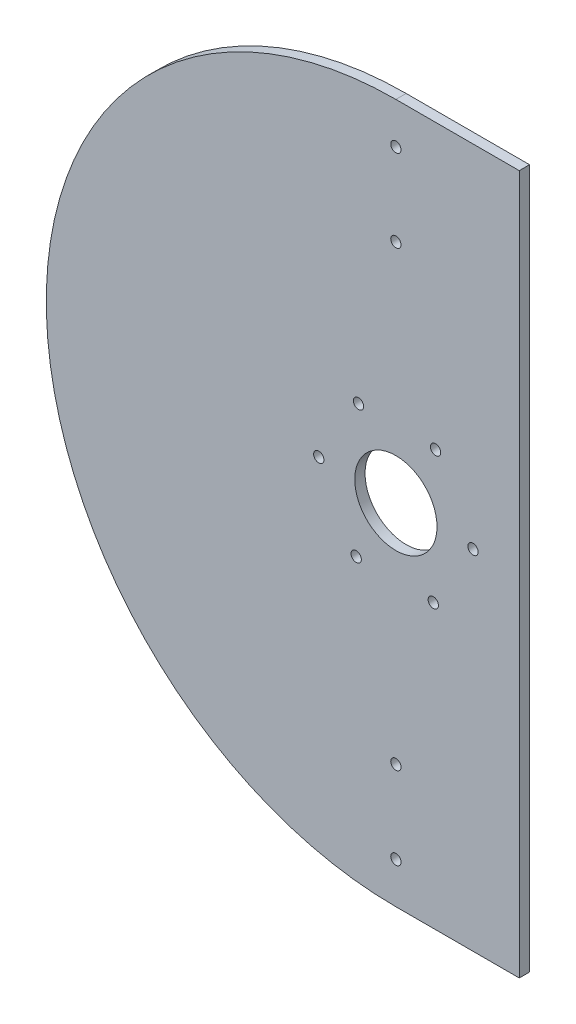
ISO-10303-21;
HEADER;
FILE_DESCRIPTION(('STEP AP214'),'2;1');
FILE_NAME('part.step','',(''),(''),'','','');
FILE_SCHEMA(('AUTOMOTIVE_DESIGN { 1 0 10303 214 1 1 1 1 }'));
ENDSEC;
DATA;
#1=APPLICATION_CONTEXT('core data for automotive mechanical design processes');
#2=APPLICATION_PROTOCOL_DEFINITION('international standard','automotive_design',2000,#1);
#3=PRODUCT_CONTEXT('',#1,'mechanical');
#4=PRODUCT('Part','Part','',(#3));
#5=PRODUCT_RELATED_PRODUCT_CATEGORY('part','',(#4));
#6=PRODUCT_DEFINITION_FORMATION('','',#4);
#7=PRODUCT_DEFINITION_CONTEXT('part definition',#1,'design');
#8=PRODUCT_DEFINITION('design','',#6,#7);
#9=PRODUCT_DEFINITION_SHAPE('','',#8);
#10=(LENGTH_UNIT() NAMED_UNIT(*) SI_UNIT(.MILLI.,.METRE.));
#11=(NAMED_UNIT(*) PLANE_ANGLE_UNIT() SI_UNIT($,.RADIAN.));
#12=(NAMED_UNIT(*) SI_UNIT($,.STERADIAN.) SOLID_ANGLE_UNIT());
#13=UNCERTAINTY_MEASURE_WITH_UNIT(LENGTH_MEASURE(1.E-05),#10,'distance_accuracy_value','');
#14=(GEOMETRIC_REPRESENTATION_CONTEXT(3) GLOBAL_UNCERTAINTY_ASSIGNED_CONTEXT((#13)) GLOBAL_UNIT_ASSIGNED_CONTEXT((#10,
#11,#12)) REPRESENTATION_CONTEXT('',''));
#15=CARTESIAN_POINT('',(0.,0.,0.));
#16=DIRECTION('',(0.,0.,1.));
#17=DIRECTION('',(1.,0.,0.));
#18=AXIS2_PLACEMENT_3D('',#15,#16,#17);
#19=CARTESIAN_POINT('',(0.,0.,0.));
#20=DIRECTION('',(0.,0.,1.));
#21=DIRECTION('',(1.,0.,0.));
#22=AXIS2_PLACEMENT_3D('',#19,#20,#21);
#23=PLANE('',#22);
#24=CARTESIAN_POINT('',(0.,0.,0.));
#25=DIRECTION('',(0.,0.,-1.));
#26=DIRECTION('',(-1.,0.,0.));
#27=AXIS2_PLACEMENT_3D('',#24,#25,#26);
#28=CIRCLE('',#27,12.7);
#29=CARTESIAN_POINT('',(-12.7,0.,0.));
#30=VERTEX_POINT('',#29);
#31=EDGE_CURVE('E211',#30,#30,#28,.T.);
#32=ORIENTED_EDGE('',*,*,#31,.F.);
#33=EDGE_LOOP('',(#32));
#34=FACE_BOUND('',#33,.T.);
#35=CARTESIAN_POINT('',(0.,95.25,0.));
#36=DIRECTION('',(0.,0.,-1.));
#37=DIRECTION('',(-1.,0.,0.));
#38=AXIS2_PLACEMENT_3D('',#35,#36,#37);
#39=CIRCLE('',#38,1.58749999999999);
#40=CARTESIAN_POINT('',(-1.58749999999999,95.25,0.));
#41=VERTEX_POINT('',#40);
#42=EDGE_CURVE('E207',#41,#41,#39,.T.);
#43=ORIENTED_EDGE('',*,*,#42,.F.);
#44=EDGE_LOOP('',(#43));
#45=FACE_BOUND('',#44,.T.);
#46=CARTESIAN_POINT('',(0.,-95.25,0.));
#47=DIRECTION('',(0.,0.,-1.));
#48=DIRECTION('',(-1.,0.,0.));
#49=AXIS2_PLACEMENT_3D('',#46,#47,#48);
#50=CIRCLE('',#49,1.58749999999999);
#51=CARTESIAN_POINT('',(-1.58750000000001,-95.25,0.));
#52=VERTEX_POINT('',#51);
#53=EDGE_CURVE('E199',#52,#52,#50,.T.);
#54=ORIENTED_EDGE('',*,*,#53,.F.);
#55=EDGE_LOOP('',(#54));
#56=FACE_BOUND('',#55,.T.);
#57=CARTESIAN_POINT('',(0.,-69.85,0.));
#58=DIRECTION('',(0.,0.,-1.));
#59=DIRECTION('',(-1.,0.,0.));
#60=AXIS2_PLACEMENT_3D('',#57,#58,#59);
#61=CIRCLE('',#60,1.58749999999999);
#62=CARTESIAN_POINT('',(-1.58750000000001,-69.85,0.));
#63=VERTEX_POINT('',#62);
#64=EDGE_CURVE('E191',#63,#63,#61,.T.);
#65=ORIENTED_EDGE('',*,*,#64,.F.);
#66=EDGE_LOOP('',(#65));
#67=FACE_BOUND('',#66,.T.);
#68=CARTESIAN_POINT('',(0.,69.85,0.));
#69=DIRECTION('',(0.,0.,-1.));
#70=DIRECTION('',(-1.,0.,0.));
#71=AXIS2_PLACEMENT_3D('',#68,#69,#70);
#72=CIRCLE('',#71,1.58749999999999);
#73=CARTESIAN_POINT('',(-1.58749999999999,69.85,0.));
#74=VERTEX_POINT('',#73);
#75=EDGE_CURVE('E183',#74,#74,#72,.T.);
#76=ORIENTED_EDGE('',*,*,#75,.F.);
#77=EDGE_LOOP('',(#76));
#78=FACE_BOUND('',#77,.T.);
#79=CARTESIAN_POINT('',(-11.5463634943787,20.8258648393213,0.));
#80=DIRECTION('',(0.,0.,-1.));
#81=DIRECTION('',(-1.,0.,0.));
#82=AXIS2_PLACEMENT_3D('',#79,#80,#81);
#83=CIRCLE('',#82,1.58749999999999);
#84=CARTESIAN_POINT('',(-13.1338634943786,20.8258648393213,0.));
#85=VERTEX_POINT('',#84);
#86=EDGE_CURVE('E167',#85,#85,#83,.T.);
#87=ORIENTED_EDGE('',*,*,#86,.F.);
#88=EDGE_LOOP('',(#87));
#89=FACE_BOUND('',#88,.T.);
#90=CARTESIAN_POINT('',(12.2625462594441,20.4123765271219,0.));
#91=DIRECTION('',(0.,0.,-1.));
#92=DIRECTION('',(-1.,0.,0.));
#93=AXIS2_PLACEMENT_3D('',#90,#91,#92);
#94=CIRCLE('',#93,1.58749999999999);
#95=CARTESIAN_POINT('',(10.6750462594441,20.4123765271219,0.));
#96=VERTEX_POINT('',#95);
#97=EDGE_CURVE('E159',#96,#96,#94,.T.);
#98=ORIENTED_EDGE('',*,*,#97,.F.);
#99=EDGE_LOOP('',(#98));
#100=FACE_BOUND('',#99,.T.);
#101=CARTESIAN_POINT('',(23.8089097538227,-0.413488312199489,0.));
#102=DIRECTION('',(0.,0.,-1.));
#103=DIRECTION('',(-1.,0.,0.));
#104=AXIS2_PLACEMENT_3D('',#101,#102,#103);
#105=CIRCLE('',#104,1.58749999999999);
#106=CARTESIAN_POINT('',(22.2214097538227,-0.413488312199489,0.));
#107=VERTEX_POINT('',#106);
#108=EDGE_CURVE('E151',#107,#107,#105,.T.);
#109=ORIENTED_EDGE('',*,*,#108,.F.);
#110=EDGE_LOOP('',(#109));
#111=FACE_BOUND('',#110,.T.);
#112=CARTESIAN_POINT('',(11.5463634943787,-20.8258648393213,0.));
#113=DIRECTION('',(0.,0.,-1.));
#114=DIRECTION('',(-1.,0.,0.));
#115=AXIS2_PLACEMENT_3D('',#112,#113,#114);
#116=CIRCLE('',#115,1.58749999999999);
#117=CARTESIAN_POINT('',(9.95886349437867,-20.8258648393213,0.));
#118=VERTEX_POINT('',#117);
#119=EDGE_CURVE('E143',#118,#118,#116,.T.);
#120=ORIENTED_EDGE('',*,*,#119,.F.);
#121=EDGE_LOOP('',(#120));
#122=FACE_BOUND('',#121,.T.);
#123=CARTESIAN_POINT('',(0.,0.,0.));
#124=DIRECTION('',(0.,0.,1.));
#125=DIRECTION('',(1.,0.,0.));
#126=AXIS2_PLACEMENT_3D('',#123,#124,#125);
#127=CIRCLE('',#126,107.95);
#128=CARTESIAN_POINT('',(0.,107.95,0.));
#129=VERTEX_POINT('',#128);
#130=CARTESIAN_POINT('',(0.,-107.95,0.));
#131=VERTEX_POINT('',#130);
#132=EDGE_CURVE('E111',#129,#131,#127,.T.);
#133=ORIENTED_EDGE('',*,*,#132,.F.);
#134=DIRECTION('',(-1.,0.,0.));
#135=VECTOR('',#134,1.);
#136=CARTESIAN_POINT('',(0.,107.95,0.));
#137=LINE('',#136,#135);
#138=CARTESIAN_POINT('',(38.1,107.95,0.));
#139=VERTEX_POINT('',#138);
#140=EDGE_CURVE('E81',#139,#129,#137,.T.);
#141=ORIENTED_EDGE('',*,*,#140,.F.);
#142=DIRECTION('',(0.,1.,0.));
#143=VECTOR('',#142,1.);
#144=CARTESIAN_POINT('',(38.1,107.95,0.));
#145=LINE('',#144,#143);
#146=CARTESIAN_POINT('',(38.1,-107.95,0.));
#147=VERTEX_POINT('',#146);
#148=EDGE_CURVE('E75',#147,#139,#145,.T.);
#149=ORIENTED_EDGE('',*,*,#148,.F.);
#150=DIRECTION('',(1.,0.,0.));
#151=VECTOR('',#150,1.);
#152=CARTESIAN_POINT('',(38.1,-107.95,0.));
#153=LINE('',#152,#151);
#154=EDGE_CURVE('E99',#131,#147,#153,.T.);
#155=ORIENTED_EDGE('',*,*,#154,.F.);
#156=EDGE_LOOP('',(#133,#141,#149,#155));
#157=FACE_BOUND('',#156,.T.);
#158=CARTESIAN_POINT('',(-12.2625462594441,-20.4123765271219,0.));
#159=DIRECTION('',(0.,0.,-1.));
#160=DIRECTION('',(-1.,0.,0.));
#161=AXIS2_PLACEMENT_3D('',#158,#159,#160);
#162=CIRCLE('',#161,1.58749999999999);
#163=CARTESIAN_POINT('',(-13.8500462594441,-20.4123765271219,0.));
#164=VERTEX_POINT('',#163);
#165=EDGE_CURVE('E135',#164,#164,#162,.T.);
#166=ORIENTED_EDGE('',*,*,#165,.F.);
#167=EDGE_LOOP('',(#166));
#168=FACE_BOUND('',#167,.T.);
#169=CARTESIAN_POINT('',(-23.8089097538228,0.413488312199489,0.));
#170=DIRECTION('',(0.,0.,-1.));
#171=DIRECTION('',(-1.,0.,0.));
#172=AXIS2_PLACEMENT_3D('',#169,#170,#171);
#173=CIRCLE('',#172,1.58749999999999);
#174=CARTESIAN_POINT('',(-25.3964097538227,0.413488312199489,0.));
#175=VERTEX_POINT('',#174);
#176=EDGE_CURVE('E175',#175,#175,#173,.T.);
#177=ORIENTED_EDGE('',*,*,#176,.F.);
#178=EDGE_LOOP('',(#177));
#179=FACE_BOUND('',#178,.T.);
#180=ADVANCED_FACE('F39',(#34,#45,#56,#67,#78,#89,#100,#111,#122,#157,#168,#179),#23,.F.);
#181=CARTESIAN_POINT('',(0.,0.,3.175));
#182=DIRECTION('',(0.,0.,1.));
#183=DIRECTION('',(1.,0.,0.));
#184=AXIS2_PLACEMENT_3D('',#181,#182,#183);
#185=PLANE('',#184);
#186=CARTESIAN_POINT('',(0.,0.,3.175));
#187=DIRECTION('',(0.,0.,1.));
#188=DIRECTION('',(1.,0.,0.));
#189=AXIS2_PLACEMENT_3D('',#186,#187,#188);
#190=CIRCLE('',#189,12.7);
#191=CARTESIAN_POINT('',(12.7,0.,3.175));
#192=VERTEX_POINT('',#191);
#193=EDGE_CURVE('E43',#192,#192,#190,.T.);
#194=ORIENTED_EDGE('',*,*,#193,.F.);
#195=EDGE_LOOP('',(#194));
#196=FACE_BOUND('',#195,.T.);
#197=CARTESIAN_POINT('',(0.,95.25,3.175));
#198=DIRECTION('',(0.,0.,-1.));
#199=DIRECTION('',(-1.,0.,0.));
#200=AXIS2_PLACEMENT_3D('',#197,#198,#199);
#201=CIRCLE('',#200,1.5875);
#202=CARTESIAN_POINT('',(-1.5875,95.25,3.175));
#203=VERTEX_POINT('',#202);
#204=EDGE_CURVE('E203',#203,#203,#201,.T.);
#205=ORIENTED_EDGE('',*,*,#204,.T.);
#206=EDGE_LOOP('',(#205));
#207=FACE_BOUND('',#206,.T.);
#208=CARTESIAN_POINT('',(0.,-95.25,3.175));
#209=DIRECTION('',(0.,0.,-1.));
#210=DIRECTION('',(-1.,0.,0.));
#211=AXIS2_PLACEMENT_3D('',#208,#209,#210);
#212=CIRCLE('',#211,1.5875);
#213=CARTESIAN_POINT('',(-1.58750000000002,-95.25,3.175));
#214=VERTEX_POINT('',#213);
#215=EDGE_CURVE('E195',#214,#214,#212,.T.);
#216=ORIENTED_EDGE('',*,*,#215,.T.);
#217=EDGE_LOOP('',(#216));
#218=FACE_BOUND('',#217,.T.);
#219=CARTESIAN_POINT('',(0.,-69.85,3.175));
#220=DIRECTION('',(0.,0.,-1.));
#221=DIRECTION('',(-1.,0.,0.));
#222=AXIS2_PLACEMENT_3D('',#219,#220,#221);
#223=CIRCLE('',#222,1.5875);
#224=CARTESIAN_POINT('',(-1.58750000000002,-69.85,3.175));
#225=VERTEX_POINT('',#224);
#226=EDGE_CURVE('E187',#225,#225,#223,.T.);
#227=ORIENTED_EDGE('',*,*,#226,.T.);
#228=EDGE_LOOP('',(#227));
#229=FACE_BOUND('',#228,.T.);
#230=CARTESIAN_POINT('',(0.,69.85,3.175));
#231=DIRECTION('',(0.,0.,-1.));
#232=DIRECTION('',(-1.,0.,0.));
#233=AXIS2_PLACEMENT_3D('',#230,#231,#232);
#234=CIRCLE('',#233,1.5875);
#235=CARTESIAN_POINT('',(-1.5875,69.85,3.175));
#236=VERTEX_POINT('',#235);
#237=EDGE_CURVE('E179',#236,#236,#234,.T.);
#238=ORIENTED_EDGE('',*,*,#237,.T.);
#239=EDGE_LOOP('',(#238));
#240=FACE_BOUND('',#239,.T.);
#241=CARTESIAN_POINT('',(-23.8089097538228,0.413488312199489,3.175));
#242=DIRECTION('',(0.,0.,-1.));
#243=DIRECTION('',(-1.,0.,0.));
#244=AXIS2_PLACEMENT_3D('',#241,#242,#243);
#245=CIRCLE('',#244,1.5875);
#246=CARTESIAN_POINT('',(-25.3964097538228,0.413488312199489,3.175));
#247=VERTEX_POINT('',#246);
#248=EDGE_CURVE('E171',#247,#247,#245,.T.);
#249=ORIENTED_EDGE('',*,*,#248,.T.);
#250=EDGE_LOOP('',(#249));
#251=FACE_BOUND('',#250,.T.);
#252=CARTESIAN_POINT('',(-11.5463634943787,20.8258648393213,3.175));
#253=DIRECTION('',(0.,0.,-1.));
#254=DIRECTION('',(-1.,0.,0.));
#255=AXIS2_PLACEMENT_3D('',#252,#253,#254);
#256=CIRCLE('',#255,1.5875);
#257=CARTESIAN_POINT('',(-13.1338634943787,20.8258648393213,3.175));
#258=VERTEX_POINT('',#257);
#259=EDGE_CURVE('E163',#258,#258,#256,.T.);
#260=ORIENTED_EDGE('',*,*,#259,.T.);
#261=EDGE_LOOP('',(#260));
#262=FACE_BOUND('',#261,.T.);
#263=CARTESIAN_POINT('',(12.2625462594441,20.4123765271219,3.175));
#264=DIRECTION('',(0.,0.,-1.));
#265=DIRECTION('',(-1.,0.,0.));
#266=AXIS2_PLACEMENT_3D('',#263,#264,#265);
#267=CIRCLE('',#266,1.5875);
#268=CARTESIAN_POINT('',(10.6750462594441,20.4123765271219,3.175));
#269=VERTEX_POINT('',#268);
#270=EDGE_CURVE('E155',#269,#269,#267,.T.);
#271=ORIENTED_EDGE('',*,*,#270,.T.);
#272=EDGE_LOOP('',(#271));
#273=FACE_BOUND('',#272,.T.);
#274=CARTESIAN_POINT('',(23.8089097538227,-0.413488312199489,3.175));
#275=DIRECTION('',(0.,0.,-1.));
#276=DIRECTION('',(-1.,0.,0.));
#277=AXIS2_PLACEMENT_3D('',#274,#275,#276);
#278=CIRCLE('',#277,1.5875);
#279=CARTESIAN_POINT('',(22.2214097538227,-0.413488312199489,3.175));
#280=VERTEX_POINT('',#279);
#281=EDGE_CURVE('E147',#280,#280,#278,.T.);
#282=ORIENTED_EDGE('',*,*,#281,.T.);
#283=EDGE_LOOP('',(#282));
#284=FACE_BOUND('',#283,.T.);
#285=CARTESIAN_POINT('',(0.,0.,3.175));
#286=DIRECTION('',(0.,0.,1.));
#287=DIRECTION('',(1.,0.,0.));
#288=AXIS2_PLACEMENT_3D('',#285,#286,#287);
#289=CIRCLE('',#288,107.95);
#290=CARTESIAN_POINT('',(0.,107.95,3.175));
#291=VERTEX_POINT('',#290);
#292=CARTESIAN_POINT('',(0.,-107.95,3.175));
#293=VERTEX_POINT('',#292);
#294=EDGE_CURVE('E94',#291,#293,#289,.T.);
#295=ORIENTED_EDGE('',*,*,#294,.T.);
#296=DIRECTION('',(1.,0.,0.));
#297=VECTOR('',#296,1.);
#298=CARTESIAN_POINT('',(38.1,-107.95,3.175));
#299=LINE('',#298,#297);
#300=CARTESIAN_POINT('',(38.1,-107.95,3.175));
#301=VERTEX_POINT('',#300);
#302=EDGE_CURVE('E88',#293,#301,#299,.T.);
#303=ORIENTED_EDGE('',*,*,#302,.T.);
#304=DIRECTION('',(0.,1.,0.));
#305=VECTOR('',#304,1.);
#306=CARTESIAN_POINT('',(38.1,107.95,3.175));
#307=LINE('',#306,#305);
#308=CARTESIAN_POINT('',(38.1,107.95,3.175));
#309=VERTEX_POINT('',#308);
#310=EDGE_CURVE('E92',#301,#309,#307,.T.);
#311=ORIENTED_EDGE('',*,*,#310,.T.);
#312=DIRECTION('',(-1.,0.,0.));
#313=VECTOR('',#312,1.);
#314=CARTESIAN_POINT('',(0.,107.95,3.175));
#315=LINE('',#314,#313);
#316=EDGE_CURVE('E58',#309,#291,#315,.T.);
#317=ORIENTED_EDGE('',*,*,#316,.T.);
#318=EDGE_LOOP('',(#295,#303,#311,#317));
#319=FACE_BOUND('',#318,.T.);
#320=CARTESIAN_POINT('',(-12.2625462594441,-20.4123765271219,3.175));
#321=DIRECTION('',(0.,0.,-1.));
#322=DIRECTION('',(-1.,0.,0.));
#323=AXIS2_PLACEMENT_3D('',#320,#321,#322);
#324=CIRCLE('',#323,1.5875);
#325=CARTESIAN_POINT('',(-13.8500462594441,-20.4123765271219,3.175));
#326=VERTEX_POINT('',#325);
#327=EDGE_CURVE('E115',#326,#326,#324,.T.);
#328=ORIENTED_EDGE('',*,*,#327,.T.);
#329=EDGE_LOOP('',(#328));
#330=FACE_BOUND('',#329,.T.);
#331=CARTESIAN_POINT('',(11.5463634943787,-20.8258648393213,3.175));
#332=DIRECTION('',(0.,0.,-1.));
#333=DIRECTION('',(-1.,0.,0.));
#334=AXIS2_PLACEMENT_3D('',#331,#332,#333);
#335=CIRCLE('',#334,1.5875);
#336=CARTESIAN_POINT('',(9.95886349437866,-20.8258648393213,3.175));
#337=VERTEX_POINT('',#336);
#338=EDGE_CURVE('E139',#337,#337,#335,.T.);
#339=ORIENTED_EDGE('',*,*,#338,.T.);
#340=EDGE_LOOP('',(#339));
#341=FACE_BOUND('',#340,.T.);
#342=ADVANCED_FACE('F89',(#196,#207,#218,#229,#240,#251,#262,#273,#284,#319,#330,#341),#185,.T.);
#343=CARTESIAN_POINT('',(0.,0.,3.175));
#344=DIRECTION('',(0.,0.,-1.));
#345=DIRECTION('',(-1.,0.,0.));
#346=AXIS2_PLACEMENT_3D('',#343,#344,#345);
#347=CYLINDRICAL_SURFACE('',#346,107.95);
#348=ORIENTED_EDGE('',*,*,#132,.T.);
#349=DIRECTION('',(0.,0.,-1.));
#350=VECTOR('',#349,1.);
#351=CARTESIAN_POINT('',(0.,-107.95,3.175));
#352=LINE('',#351,#350);
#353=EDGE_CURVE('E11',#293,#131,#352,.T.);
#354=ORIENTED_EDGE('',*,*,#353,.F.);
#355=ORIENTED_EDGE('',*,*,#294,.F.);
#356=DIRECTION('',(0.,0.,-1.));
#357=VECTOR('',#356,1.);
#358=CARTESIAN_POINT('',(0.,107.95,3.175));
#359=LINE('',#358,#357);
#360=EDGE_CURVE('E107',#291,#129,#359,.T.);
#361=ORIENTED_EDGE('',*,*,#360,.T.);
#362=EDGE_LOOP('',(#348,#354,#355,#361));
#363=FACE_BOUND('',#362,.T.);
#364=ADVANCED_FACE('F41',(#363),#347,.T.);
#365=CARTESIAN_POINT('',(38.1,-107.95,3.175));
#366=DIRECTION('',(0.,1.,0.));
#367=DIRECTION('',(0.,0.,1.));
#368=AXIS2_PLACEMENT_3D('',#365,#366,#367);
#369=PLANE('',#368);
#370=ORIENTED_EDGE('',*,*,#154,.T.);
#371=DIRECTION('',(0.,0.,-1.));
#372=VECTOR('',#371,1.);
#373=CARTESIAN_POINT('',(38.1,-107.95,3.175));
#374=LINE('',#373,#372);
#375=EDGE_CURVE('E50',#301,#147,#374,.T.);
#376=ORIENTED_EDGE('',*,*,#375,.F.);
#377=ORIENTED_EDGE('',*,*,#302,.F.);
#378=ORIENTED_EDGE('',*,*,#353,.T.);
#379=EDGE_LOOP('',(#370,#376,#377,#378));
#380=FACE_BOUND('',#379,.T.);
#381=ADVANCED_FACE('F98',(#380),#369,.F.);
#382=CARTESIAN_POINT('',(38.1,107.95,3.175));
#383=DIRECTION('',(-1.,0.,0.));
#384=DIRECTION('',(0.,0.,1.));
#385=AXIS2_PLACEMENT_3D('',#382,#383,#384);
#386=PLANE('',#385);
#387=ORIENTED_EDGE('',*,*,#148,.T.);
#388=DIRECTION('',(0.,0.,-1.));
#389=VECTOR('',#388,1.);
#390=CARTESIAN_POINT('',(38.1,107.95,3.175));
#391=LINE('',#390,#389);
#392=EDGE_CURVE('E101',#309,#139,#391,.T.);
#393=ORIENTED_EDGE('',*,*,#392,.F.);
#394=ORIENTED_EDGE('',*,*,#310,.F.);
#395=ORIENTED_EDGE('',*,*,#375,.T.);
#396=EDGE_LOOP('',(#387,#393,#394,#395));
#397=FACE_BOUND('',#396,.T.);
#398=ADVANCED_FACE('F103',(#397),#386,.F.);
#399=CARTESIAN_POINT('',(0.,107.95,3.175));
#400=DIRECTION('',(0.,-1.,0.));
#401=DIRECTION('',(0.,0.,-1.));
#402=AXIS2_PLACEMENT_3D('',#399,#400,#401);
#403=PLANE('',#402);
#404=ORIENTED_EDGE('',*,*,#140,.T.);
#405=ORIENTED_EDGE('',*,*,#360,.F.);
#406=ORIENTED_EDGE('',*,*,#316,.F.);
#407=ORIENTED_EDGE('',*,*,#392,.T.);
#408=EDGE_LOOP('',(#404,#405,#406,#407));
#409=FACE_BOUND('',#408,.T.);
#410=ADVANCED_FACE('F125',(#409),#403,.F.);
#411=CARTESIAN_POINT('',(-12.2625462594441,-20.4123765271219,0.));
#412=DIRECTION('',(0.,0.,-1.));
#413=DIRECTION('',(-1.,0.,0.));
#414=AXIS2_PLACEMENT_3D('',#411,#412,#413);
#415=CYLINDRICAL_SURFACE('',#414,1.58749999999999);
#416=ORIENTED_EDGE('',*,*,#327,.F.);
#417=EDGE_LOOP('',(#416));
#418=FACE_BOUND('',#417,.T.);
#419=ORIENTED_EDGE('',*,*,#165,.T.);
#420=EDGE_LOOP('',(#419));
#421=FACE_BOUND('',#420,.T.);
#422=ADVANCED_FACE('F256',(#418,#421),#415,.F.);
#423=CARTESIAN_POINT('',(11.5463634943787,-20.8258648393213,0.));
#424=DIRECTION('',(0.,0.,-1.));
#425=DIRECTION('',(-1.,0.,0.));
#426=AXIS2_PLACEMENT_3D('',#423,#424,#425);
#427=CYLINDRICAL_SURFACE('',#426,1.58749999999999);
#428=ORIENTED_EDGE('',*,*,#338,.F.);
#429=EDGE_LOOP('',(#428));
#430=FACE_BOUND('',#429,.T.);
#431=ORIENTED_EDGE('',*,*,#119,.T.);
#432=EDGE_LOOP('',(#431));
#433=FACE_BOUND('',#432,.T.);
#434=ADVANCED_FACE('F245',(#430,#433),#427,.F.);
#435=CARTESIAN_POINT('',(23.8089097538227,-0.413488312199489,0.));
#436=DIRECTION('',(0.,0.,-1.));
#437=DIRECTION('',(-1.,0.,0.));
#438=AXIS2_PLACEMENT_3D('',#435,#436,#437);
#439=CYLINDRICAL_SURFACE('',#438,1.58749999999999);
#440=ORIENTED_EDGE('',*,*,#281,.F.);
#441=EDGE_LOOP('',(#440));
#442=FACE_BOUND('',#441,.T.);
#443=ORIENTED_EDGE('',*,*,#108,.T.);
#444=EDGE_LOOP('',(#443));
#445=FACE_BOUND('',#444,.T.);
#446=ADVANCED_FACE('F241',(#442,#445),#439,.F.);
#447=CARTESIAN_POINT('',(12.2625462594441,20.4123765271219,0.));
#448=DIRECTION('',(0.,0.,-1.));
#449=DIRECTION('',(-1.,0.,0.));
#450=AXIS2_PLACEMENT_3D('',#447,#448,#449);
#451=CYLINDRICAL_SURFACE('',#450,1.58749999999999);
#452=ORIENTED_EDGE('',*,*,#270,.F.);
#453=EDGE_LOOP('',(#452));
#454=FACE_BOUND('',#453,.T.);
#455=ORIENTED_EDGE('',*,*,#97,.T.);
#456=EDGE_LOOP('',(#455));
#457=FACE_BOUND('',#456,.T.);
#458=ADVANCED_FACE('F244',(#454,#457),#451,.F.);
#459=CARTESIAN_POINT('',(-11.5463634943787,20.8258648393213,0.));
#460=DIRECTION('',(0.,0.,-1.));
#461=DIRECTION('',(-1.,0.,0.));
#462=AXIS2_PLACEMENT_3D('',#459,#460,#461);
#463=CYLINDRICAL_SURFACE('',#462,1.58749999999999);
#464=ORIENTED_EDGE('',*,*,#259,.F.);
#465=EDGE_LOOP('',(#464));
#466=FACE_BOUND('',#465,.T.);
#467=ORIENTED_EDGE('',*,*,#86,.T.);
#468=EDGE_LOOP('',(#467));
#469=FACE_BOUND('',#468,.T.);
#470=ADVANCED_FACE('F338',(#466,#469),#463,.F.);
#471=CARTESIAN_POINT('',(-23.8089097538228,0.413488312199489,0.));
#472=DIRECTION('',(0.,0.,-1.));
#473=DIRECTION('',(-1.,0.,0.));
#474=AXIS2_PLACEMENT_3D('',#471,#472,#473);
#475=CYLINDRICAL_SURFACE('',#474,1.58749999999999);
#476=ORIENTED_EDGE('',*,*,#248,.F.);
#477=EDGE_LOOP('',(#476));
#478=FACE_BOUND('',#477,.T.);
#479=ORIENTED_EDGE('',*,*,#176,.T.);
#480=EDGE_LOOP('',(#479));
#481=FACE_BOUND('',#480,.T.);
#482=ADVANCED_FACE('F328',(#478,#481),#475,.F.);
#483=CARTESIAN_POINT('',(0.,69.85,0.));
#484=DIRECTION('',(0.,0.,-1.));
#485=DIRECTION('',(-1.,0.,0.));
#486=AXIS2_PLACEMENT_3D('',#483,#484,#485);
#487=CYLINDRICAL_SURFACE('',#486,1.58749999999999);
#488=ORIENTED_EDGE('',*,*,#237,.F.);
#489=EDGE_LOOP('',(#488));
#490=FACE_BOUND('',#489,.T.);
#491=ORIENTED_EDGE('',*,*,#75,.T.);
#492=EDGE_LOOP('',(#491));
#493=FACE_BOUND('',#492,.T.);
#494=ADVANCED_FACE('F318',(#490,#493),#487,.F.);
#495=CARTESIAN_POINT('',(0.,-69.85,0.));
#496=DIRECTION('',(0.,0.,-1.));
#497=DIRECTION('',(-1.,0.,0.));
#498=AXIS2_PLACEMENT_3D('',#495,#496,#497);
#499=CYLINDRICAL_SURFACE('',#498,1.58749999999999);
#500=ORIENTED_EDGE('',*,*,#226,.F.);
#501=EDGE_LOOP('',(#500));
#502=FACE_BOUND('',#501,.T.);
#503=ORIENTED_EDGE('',*,*,#64,.T.);
#504=EDGE_LOOP('',(#503));
#505=FACE_BOUND('',#504,.T.);
#506=ADVANCED_FACE('F308',(#502,#505),#499,.F.);
#507=CARTESIAN_POINT('',(0.,-95.25,0.));
#508=DIRECTION('',(0.,0.,-1.));
#509=DIRECTION('',(-1.,0.,0.));
#510=AXIS2_PLACEMENT_3D('',#507,#508,#509);
#511=CYLINDRICAL_SURFACE('',#510,1.58749999999999);
#512=ORIENTED_EDGE('',*,*,#215,.F.);
#513=EDGE_LOOP('',(#512));
#514=FACE_BOUND('',#513,.T.);
#515=ORIENTED_EDGE('',*,*,#53,.T.);
#516=EDGE_LOOP('',(#515));
#517=FACE_BOUND('',#516,.T.);
#518=ADVANCED_FACE('F296',(#514,#517),#511,.F.);
#519=CARTESIAN_POINT('',(0.,95.25,0.));
#520=DIRECTION('',(0.,0.,-1.));
#521=DIRECTION('',(-1.,0.,0.));
#522=AXIS2_PLACEMENT_3D('',#519,#520,#521);
#523=CYLINDRICAL_SURFACE('',#522,1.58749999999999);
#524=ORIENTED_EDGE('',*,*,#204,.F.);
#525=EDGE_LOOP('',(#524));
#526=FACE_BOUND('',#525,.T.);
#527=ORIENTED_EDGE('',*,*,#42,.T.);
#528=EDGE_LOOP('',(#527));
#529=FACE_BOUND('',#528,.T.);
#530=ADVANCED_FACE('F291',(#526,#529),#523,.F.);
#531=CARTESIAN_POINT('',(0.,0.,17.0815));
#532=DIRECTION('',(0.,0.,-1.));
#533=DIRECTION('',(-1.,0.,0.));
#534=AXIS2_PLACEMENT_3D('',#531,#532,#533);
#535=CYLINDRICAL_SURFACE('',#534,12.7);
#536=ORIENTED_EDGE('',*,*,#193,.T.);
#537=EDGE_LOOP('',(#536));
#538=FACE_BOUND('',#537,.T.);
#539=ORIENTED_EDGE('',*,*,#31,.T.);
#540=EDGE_LOOP('',(#539));
#541=FACE_BOUND('',#540,.T.);
#542=ADVANCED_FACE('F220',(#538,#541),#535,.F.);
#543=CLOSED_SHELL('',(#180,#342,#364,#381,#398,#410,#422,#434,#446,#458,#470,#482,#494,#506,
#518,#530,#542));
#544=MANIFOLD_SOLID_BREP('B2',#543);
#545=ADVANCED_BREP_SHAPE_REPRESENTATION('',(#18,#544),#14);
#546=SHAPE_DEFINITION_REPRESENTATION(#9,#545);
ENDSEC;
END-ISO-10303-21;
